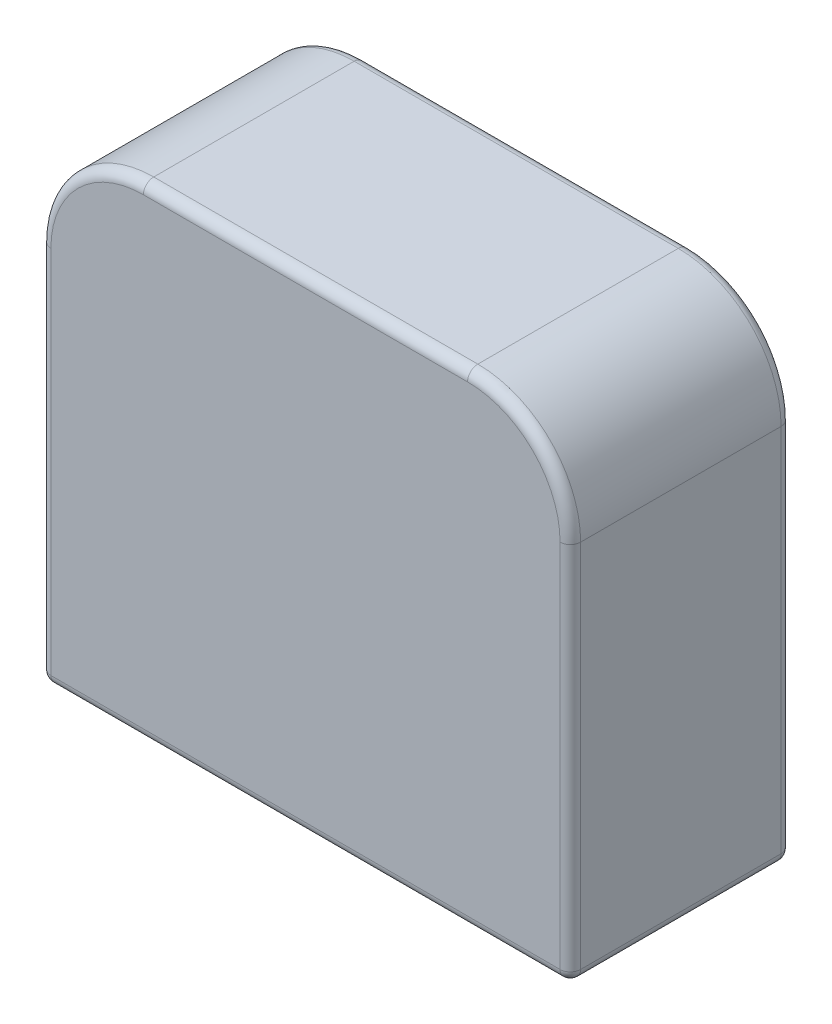
ISO-10303-21;
HEADER;
FILE_DESCRIPTION(('STEP AP214'),'2;1');
FILE_NAME('part.step','',(''),(''),'','','');
FILE_SCHEMA(('AUTOMOTIVE_DESIGN { 1 0 10303 214 1 1 1 1 }'));
ENDSEC;
DATA;
#1=APPLICATION_CONTEXT('core data for automotive mechanical design processes');
#2=APPLICATION_PROTOCOL_DEFINITION('international standard','automotive_design',2000,#1);
#3=PRODUCT_CONTEXT('',#1,'mechanical');
#4=PRODUCT('Part','Part','',(#3));
#5=PRODUCT_RELATED_PRODUCT_CATEGORY('part','',(#4));
#6=PRODUCT_DEFINITION_FORMATION('','',#4);
#7=PRODUCT_DEFINITION_CONTEXT('part definition',#1,'design');
#8=PRODUCT_DEFINITION('design','',#6,#7);
#9=PRODUCT_DEFINITION_SHAPE('','',#8);
#10=(LENGTH_UNIT() NAMED_UNIT(*) SI_UNIT(.MILLI.,.METRE.));
#11=(NAMED_UNIT(*) PLANE_ANGLE_UNIT() SI_UNIT($,.RADIAN.));
#12=(NAMED_UNIT(*) SI_UNIT($,.STERADIAN.) SOLID_ANGLE_UNIT());
#13=UNCERTAINTY_MEASURE_WITH_UNIT(LENGTH_MEASURE(1.E-05),#10,'distance_accuracy_value','');
#14=(GEOMETRIC_REPRESENTATION_CONTEXT(3) GLOBAL_UNCERTAINTY_ASSIGNED_CONTEXT((#13)) GLOBAL_UNIT_ASSIGNED_CONTEXT((#10,
#11,#12)) REPRESENTATION_CONTEXT('',''));
#15=CARTESIAN_POINT('',(0.,0.,0.));
#16=DIRECTION('',(0.,0.,1.));
#17=DIRECTION('',(1.,0.,0.));
#18=AXIS2_PLACEMENT_3D('',#15,#16,#17);
#19=CARTESIAN_POINT('',(25.765,23.5,21.5));
#20=DIRECTION('',(-1.,0.,0.));
#21=DIRECTION('',(0.,-1.,0.));
#22=AXIS2_PLACEMENT_3D('',#19,#20,#21);
#23=PLANE('',#22);
#24=DIRECTION('',(0.,0.,-1.));
#25=VECTOR('',#24,1.);
#26=CARTESIAN_POINT('',(25.765,-22.5,21.5));
#27=LINE('',#26,#25);
#28=CARTESIAN_POINT('',(25.765,-22.5,20.5));
#29=VERTEX_POINT('',#28);
#30=CARTESIAN_POINT('',(25.765,-22.5,1.));
#31=VERTEX_POINT('',#30);
#32=EDGE_CURVE('E50',#29,#31,#27,.T.);
#33=ORIENTED_EDGE('',*,*,#32,.T.);
#34=DIRECTION('',(0.,1.,0.));
#35=VECTOR('',#34,1.);
#36=CARTESIAN_POINT('',(25.765,23.5,1.));
#37=LINE('',#36,#35);
#38=CARTESIAN_POINT('',(25.765,13.5,1.));
#39=VERTEX_POINT('',#38);
#40=EDGE_CURVE('E11',#31,#39,#37,.T.);
#41=ORIENTED_EDGE('',*,*,#40,.T.);
#42=DIRECTION('',(0.,0.,-1.));
#43=VECTOR('',#42,1.);
#44=CARTESIAN_POINT('',(25.765,13.5,21.5));
#45=LINE('',#44,#43);
#46=CARTESIAN_POINT('',(25.765,13.5,20.5));
#47=VERTEX_POINT('',#46);
#48=EDGE_CURVE('E164',#39,#47,#45,.F.);
#49=ORIENTED_EDGE('',*,*,#48,.T.);
#50=DIRECTION('',(0.,1.,0.));
#51=VECTOR('',#50,1.);
#52=CARTESIAN_POINT('',(25.765,-23.5,20.5));
#53=LINE('',#52,#51);
#54=EDGE_CURVE('E61',#47,#29,#53,.F.);
#55=ORIENTED_EDGE('',*,*,#54,.T.);
#56=EDGE_LOOP('',(#33,#41,#49,#55));
#57=FACE_BOUND('',#56,.T.);
#58=ADVANCED_FACE('F41',(#57),#23,.F.);
#59=CARTESIAN_POINT('',(-25.765,23.5,21.5));
#60=DIRECTION('',(0.,-1.,0.));
#61=DIRECTION('',(0.,0.,-1.));
#62=AXIS2_PLACEMENT_3D('',#59,#60,#61);
#63=PLANE('',#62);
#64=DIRECTION('',(0.,0.,-1.));
#65=VECTOR('',#64,1.);
#66=CARTESIAN_POINT('',(15.765,23.5,21.5));
#67=LINE('',#66,#65);
#68=CARTESIAN_POINT('',(15.765,23.5,20.5));
#69=VERTEX_POINT('',#68);
#70=CARTESIAN_POINT('',(15.765,23.5,1.));
#71=VERTEX_POINT('',#70);
#72=EDGE_CURVE('E222',#69,#71,#67,.T.);
#73=ORIENTED_EDGE('',*,*,#72,.T.);
#74=DIRECTION('',(-1.,0.,0.));
#75=VECTOR('',#74,1.);
#76=CARTESIAN_POINT('',(-25.765,23.5,1.));
#77=LINE('',#76,#75);
#78=CARTESIAN_POINT('',(-15.765,23.5,1.));
#79=VERTEX_POINT('',#78);
#80=EDGE_CURVE('E246',#71,#79,#77,.T.);
#81=ORIENTED_EDGE('',*,*,#80,.T.);
#82=DIRECTION('',(0.,0.,-1.));
#83=VECTOR('',#82,1.);
#84=CARTESIAN_POINT('',(-15.765,23.5,21.5));
#85=LINE('',#84,#83);
#86=CARTESIAN_POINT('',(-15.765,23.5,20.5));
#87=VERTEX_POINT('',#86);
#88=EDGE_CURVE('E227',#79,#87,#85,.F.);
#89=ORIENTED_EDGE('',*,*,#88,.T.);
#90=DIRECTION('',(-1.,0.,0.));
#91=VECTOR('',#90,1.);
#92=CARTESIAN_POINT('',(15.765,23.5,20.5));
#93=LINE('',#92,#91);
#94=EDGE_CURVE('E244',#87,#69,#93,.F.);
#95=ORIENTED_EDGE('',*,*,#94,.T.);
#96=EDGE_LOOP('',(#73,#81,#89,#95));
#97=FACE_BOUND('',#96,.T.);
#98=ADVANCED_FACE('F290',(#97),#63,.F.);
#99=CARTESIAN_POINT('',(-25.765,23.5,21.5));
#100=DIRECTION('',(1.,0.,0.));
#101=DIRECTION('',(0.,1.,0.));
#102=AXIS2_PLACEMENT_3D('',#99,#100,#101);
#103=PLANE('',#102);
#104=DIRECTION('',(0.,0.,-1.));
#105=VECTOR('',#104,1.);
#106=CARTESIAN_POINT('',(-25.765,13.5,21.5));
#107=LINE('',#106,#105);
#108=CARTESIAN_POINT('',(-25.765,13.5,20.5));
#109=VERTEX_POINT('',#108);
#110=CARTESIAN_POINT('',(-25.765,13.5,1.));
#111=VERTEX_POINT('',#110);
#112=EDGE_CURVE('E216',#109,#111,#107,.T.);
#113=ORIENTED_EDGE('',*,*,#112,.T.);
#114=DIRECTION('',(0.,-1.,0.));
#115=VECTOR('',#114,1.);
#116=CARTESIAN_POINT('',(-25.765,23.5,1.));
#117=LINE('',#116,#115);
#118=CARTESIAN_POINT('',(-25.765,-22.5,1.));
#119=VERTEX_POINT('',#118);
#120=EDGE_CURVE('E277',#111,#119,#117,.T.);
#121=ORIENTED_EDGE('',*,*,#120,.T.);
#122=DIRECTION('',(0.,0.,-1.));
#123=VECTOR('',#122,1.);
#124=CARTESIAN_POINT('',(-25.765,-22.5,21.5));
#125=LINE('',#124,#123);
#126=CARTESIAN_POINT('',(-25.765,-22.5,20.5));
#127=VERTEX_POINT('',#126);
#128=EDGE_CURVE('E275',#119,#127,#125,.F.);
#129=ORIENTED_EDGE('',*,*,#128,.T.);
#130=DIRECTION('',(0.,-1.,0.));
#131=VECTOR('',#130,1.);
#132=CARTESIAN_POINT('',(-25.765,13.5,20.5));
#133=LINE('',#132,#131);
#134=EDGE_CURVE('E273',#127,#109,#133,.F.);
#135=ORIENTED_EDGE('',*,*,#134,.T.);
#136=EDGE_LOOP('',(#113,#121,#129,#135));
#137=FACE_BOUND('',#136,.T.);
#138=ADVANCED_FACE('F306',(#137),#103,.F.);
#139=CARTESIAN_POINT('',(-25.765,-23.5,21.5));
#140=DIRECTION('',(0.,1.,0.));
#141=DIRECTION('',(0.,0.,1.));
#142=AXIS2_PLACEMENT_3D('',#139,#140,#141);
#143=PLANE('',#142);
#144=DIRECTION('',(1.,0.,0.));
#145=VECTOR('',#144,1.);
#146=CARTESIAN_POINT('',(-25.765,-23.5,20.5));
#147=LINE('',#146,#145);
#148=CARTESIAN_POINT('',(24.765,-23.5,20.5));
#149=VERTEX_POINT('',#148);
#150=CARTESIAN_POINT('',(-24.765,-23.5,20.5));
#151=VERTEX_POINT('',#150);
#152=EDGE_CURVE('E264',#149,#151,#147,.F.);
#153=ORIENTED_EDGE('',*,*,#152,.T.);
#154=DIRECTION('',(0.,0.,-1.));
#155=VECTOR('',#154,1.);
#156=CARTESIAN_POINT('',(-24.765,-23.5,21.5));
#157=LINE('',#156,#155);
#158=CARTESIAN_POINT('',(-24.765,-23.5,1.));
#159=VERTEX_POINT('',#158);
#160=EDGE_CURVE('E270',#151,#159,#157,.T.);
#161=ORIENTED_EDGE('',*,*,#160,.T.);
#162=DIRECTION('',(1.,0.,0.));
#163=VECTOR('',#162,1.);
#164=CARTESIAN_POINT('',(-25.765,-23.5,1.));
#165=LINE('',#164,#163);
#166=CARTESIAN_POINT('',(24.765,-23.5,1.));
#167=VERTEX_POINT('',#166);
#168=EDGE_CURVE('E268',#159,#167,#165,.T.);
#169=ORIENTED_EDGE('',*,*,#168,.T.);
#170=DIRECTION('',(0.,0.,-1.));
#171=VECTOR('',#170,1.);
#172=CARTESIAN_POINT('',(24.765,-23.5,21.5));
#173=LINE('',#172,#171);
#174=EDGE_CURVE('E266',#167,#149,#173,.F.);
#175=ORIENTED_EDGE('',*,*,#174,.T.);
#176=EDGE_LOOP('',(#153,#161,#169,#175));
#177=FACE_BOUND('',#176,.T.);
#178=ADVANCED_FACE('F322',(#177),#143,.F.);
#179=CARTESIAN_POINT('',(0.,0.,21.5));
#180=DIRECTION('',(0.,0.,1.));
#181=DIRECTION('',(1.,0.,0.));
#182=AXIS2_PLACEMENT_3D('',#179,#180,#181);
#183=PLANE('',#182);
#184=CARTESIAN_POINT('',(-15.765,13.5,21.5));
#185=DIRECTION('',(0.,0.,1.));
#186=DIRECTION('',(1.,0.,0.));
#187=AXIS2_PLACEMENT_3D('',#184,#185,#186);
#188=CIRCLE('',#187,9.);
#189=CARTESIAN_POINT('',(-15.765,22.5,21.5));
#190=VERTEX_POINT('',#189);
#191=CARTESIAN_POINT('',(-24.765,13.5,21.5));
#192=VERTEX_POINT('',#191);
#193=EDGE_CURVE('E259',#190,#192,#188,.T.);
#194=ORIENTED_EDGE('',*,*,#193,.T.);
#195=DIRECTION('',(0.,-1.,0.));
#196=VECTOR('',#195,1.);
#197=CARTESIAN_POINT('',(-24.765,-23.5,21.5));
#198=LINE('',#197,#196);
#199=CARTESIAN_POINT('',(-24.765,-22.5,21.5));
#200=VERTEX_POINT('',#199);
#201=EDGE_CURVE('E262',#192,#200,#198,.T.);
#202=ORIENTED_EDGE('',*,*,#201,.T.);
#203=DIRECTION('',(1.,0.,0.));
#204=VECTOR('',#203,1.);
#205=CARTESIAN_POINT('',(25.765,-22.5,21.5));
#206=LINE('',#205,#204);
#207=CARTESIAN_POINT('',(24.765,-22.5,21.5));
#208=VERTEX_POINT('',#207);
#209=EDGE_CURVE('E253',#200,#208,#206,.T.);
#210=ORIENTED_EDGE('',*,*,#209,.T.);
#211=DIRECTION('',(0.,1.,0.));
#212=VECTOR('',#211,1.);
#213=CARTESIAN_POINT('',(24.765,13.5,21.5));
#214=LINE('',#213,#212);
#215=CARTESIAN_POINT('',(24.765,13.5,21.5));
#216=VERTEX_POINT('',#215);
#217=EDGE_CURVE('E251',#208,#216,#214,.T.);
#218=ORIENTED_EDGE('',*,*,#217,.T.);
#219=CARTESIAN_POINT('',(15.765,13.5,21.5));
#220=DIRECTION('',(0.,0.,1.));
#221=DIRECTION('',(1.,0.,0.));
#222=AXIS2_PLACEMENT_3D('',#219,#220,#221);
#223=CIRCLE('',#222,9.);
#224=CARTESIAN_POINT('',(15.765,22.5,21.5));
#225=VERTEX_POINT('',#224);
#226=EDGE_CURVE('E255',#216,#225,#223,.T.);
#227=ORIENTED_EDGE('',*,*,#226,.T.);
#228=DIRECTION('',(-1.,0.,0.));
#229=VECTOR('',#228,1.);
#230=CARTESIAN_POINT('',(-15.765,22.5,21.5));
#231=LINE('',#230,#229);
#232=EDGE_CURVE('E257',#225,#190,#231,.T.);
#233=ORIENTED_EDGE('',*,*,#232,.T.);
#234=EDGE_LOOP('',(#194,#202,#210,#218,#227,#233));
#235=FACE_BOUND('',#234,.T.);
#236=ADVANCED_FACE('F420',(#235),#183,.T.);
#237=CARTESIAN_POINT('',(0.,0.,0.));
#238=DIRECTION('',(0.,0.,1.));
#239=DIRECTION('',(1.,0.,0.));
#240=AXIS2_PLACEMENT_3D('',#237,#238,#239);
#241=PLANE('',#240);
#242=DIRECTION('',(1.,0.,0.));
#243=VECTOR('',#242,1.);
#244=CARTESIAN_POINT('',(0.,-22.5,0.));
#245=LINE('',#244,#243);
#246=CARTESIAN_POINT('',(24.765,-22.5,0.));
#247=VERTEX_POINT('',#246);
#248=CARTESIAN_POINT('',(-24.765,-22.5,0.));
#249=VERTEX_POINT('',#248);
#250=EDGE_CURVE('E153',#247,#249,#245,.F.);
#251=ORIENTED_EDGE('',*,*,#250,.T.);
#252=DIRECTION('',(0.,-1.,0.));
#253=VECTOR('',#252,1.);
#254=CARTESIAN_POINT('',(-24.765,0.,0.));
#255=LINE('',#254,#253);
#256=CARTESIAN_POINT('',(-24.765,13.5,0.));
#257=VERTEX_POINT('',#256);
#258=EDGE_CURVE('E237',#249,#257,#255,.F.);
#259=ORIENTED_EDGE('',*,*,#258,.T.);
#260=CARTESIAN_POINT('',(-15.765,13.5,0.));
#261=DIRECTION('',(0.,0.,1.));
#262=DIRECTION('',(1.,0.,0.));
#263=AXIS2_PLACEMENT_3D('',#260,#261,#262);
#264=CIRCLE('',#263,9.);
#265=CARTESIAN_POINT('',(-15.765,22.5,0.));
#266=VERTEX_POINT('',#265);
#267=EDGE_CURVE('E235',#257,#266,#264,.F.);
#268=ORIENTED_EDGE('',*,*,#267,.T.);
#269=DIRECTION('',(-1.,0.,0.));
#270=VECTOR('',#269,1.);
#271=CARTESIAN_POINT('',(0.,22.5,0.));
#272=LINE('',#271,#270);
#273=CARTESIAN_POINT('',(15.765,22.5,0.));
#274=VERTEX_POINT('',#273);
#275=EDGE_CURVE('E148',#266,#274,#272,.F.);
#276=ORIENTED_EDGE('',*,*,#275,.T.);
#277=CARTESIAN_POINT('',(15.765,13.5,0.));
#278=DIRECTION('',(0.,0.,1.));
#279=DIRECTION('',(1.,0.,0.));
#280=AXIS2_PLACEMENT_3D('',#277,#278,#279);
#281=CIRCLE('',#280,9.);
#282=CARTESIAN_POINT('',(24.765,13.5,0.));
#283=VERTEX_POINT('',#282);
#284=EDGE_CURVE('E141',#274,#283,#281,.F.);
#285=ORIENTED_EDGE('',*,*,#284,.T.);
#286=DIRECTION('',(0.,1.,0.));
#287=VECTOR('',#286,1.);
#288=CARTESIAN_POINT('',(24.765,0.,0.));
#289=LINE('',#288,#287);
#290=EDGE_CURVE('E144',#283,#247,#289,.F.);
#291=ORIENTED_EDGE('',*,*,#290,.T.);
#292=EDGE_LOOP('',(#251,#259,#268,#276,#285,#291));
#293=FACE_BOUND('',#292,.T.);
#294=ADVANCED_FACE('F143',(#293),#241,.F.);
#295=CARTESIAN_POINT('',(-15.765,13.5,21.5));
#296=DIRECTION('',(0.,0.,-1.));
#297=DIRECTION('',(-1.,0.,0.));
#298=AXIS2_PLACEMENT_3D('',#295,#296,#297);
#299=CYLINDRICAL_SURFACE('',#298,10.);
#300=ORIENTED_EDGE('',*,*,#88,.F.);
#301=CARTESIAN_POINT('',(-15.765,13.5,1.));
#302=DIRECTION('',(0.,0.,1.));
#303=DIRECTION('',(1.,0.,0.));
#304=AXIS2_PLACEMENT_3D('',#301,#302,#303);
#305=CIRCLE('',#304,10.);
#306=EDGE_CURVE('E241',#79,#111,#305,.T.);
#307=ORIENTED_EDGE('',*,*,#306,.T.);
#308=ORIENTED_EDGE('',*,*,#112,.F.);
#309=CARTESIAN_POINT('',(-15.765,13.5,20.5));
#310=DIRECTION('',(0.,0.,1.));
#311=DIRECTION('',(1.,0.,0.));
#312=AXIS2_PLACEMENT_3D('',#309,#310,#311);
#313=CIRCLE('',#312,10.);
#314=EDGE_CURVE('E239',#109,#87,#313,.F.);
#315=ORIENTED_EDGE('',*,*,#314,.T.);
#316=EDGE_LOOP('',(#300,#307,#308,#315));
#317=FACE_BOUND('',#316,.T.);
#318=ADVANCED_FACE('F294',(#317),#299,.T.);
#319=CARTESIAN_POINT('',(15.765,13.5,21.5));
#320=DIRECTION('',(0.,0.,-1.));
#321=DIRECTION('',(-1.,0.,0.));
#322=AXIS2_PLACEMENT_3D('',#319,#320,#321);
#323=CYLINDRICAL_SURFACE('',#322,10.);
#324=ORIENTED_EDGE('',*,*,#48,.F.);
#325=CARTESIAN_POINT('',(15.765,13.5,1.));
#326=DIRECTION('',(0.,0.,1.));
#327=DIRECTION('',(1.,0.,0.));
#328=AXIS2_PLACEMENT_3D('',#325,#326,#327);
#329=CIRCLE('',#328,10.);
#330=EDGE_CURVE('E167',#39,#71,#329,.T.);
#331=ORIENTED_EDGE('',*,*,#330,.T.);
#332=ORIENTED_EDGE('',*,*,#72,.F.);
#333=CARTESIAN_POINT('',(15.765,13.5,20.5));
#334=DIRECTION('',(0.,0.,1.));
#335=DIRECTION('',(1.,0.,0.));
#336=AXIS2_PLACEMENT_3D('',#333,#334,#335);
#337=CIRCLE('',#336,10.);
#338=EDGE_CURVE('E248',#69,#47,#337,.F.);
#339=ORIENTED_EDGE('',*,*,#338,.T.);
#340=EDGE_LOOP('',(#324,#331,#332,#339));
#341=FACE_BOUND('',#340,.T.);
#342=ADVANCED_FACE('F342',(#341),#323,.T.);
#343=CARTESIAN_POINT('',(15.765,13.5,20.5));
#344=DIRECTION('',(0.,0.,1.));
#345=DIRECTION('',(1.,0.,0.));
#346=AXIS2_PLACEMENT_3D('',#343,#344,#345);
#347=TOROIDAL_SURFACE('',#346,9.,1.);
#348=CARTESIAN_POINT('',(24.765,13.5,20.5));
#349=DIRECTION('',(0.,-1.,0.));
#350=DIRECTION('',(0.,0.,-1.));
#351=AXIS2_PLACEMENT_3D('',#348,#349,#350);
#352=CIRCLE('',#351,1.);
#353=EDGE_CURVE('E210',#47,#216,#352,.T.);
#354=ORIENTED_EDGE('',*,*,#353,.F.);
#355=ORIENTED_EDGE('',*,*,#338,.F.);
#356=CARTESIAN_POINT('',(15.765,22.5,20.5));
#357=DIRECTION('',(-1.,0.,0.));
#358=DIRECTION('',(0.,0.,1.));
#359=AXIS2_PLACEMENT_3D('',#356,#357,#358);
#360=CIRCLE('',#359,1.);
#361=EDGE_CURVE('E45',#225,#69,#360,.T.);
#362=ORIENTED_EDGE('',*,*,#361,.F.);
#363=ORIENTED_EDGE('',*,*,#226,.F.);
#364=EDGE_LOOP('',(#354,#355,#362,#363));
#365=FACE_BOUND('',#364,.T.);
#366=ADVANCED_FACE('F43',(#365),#347,.T.);
#367=CARTESIAN_POINT('',(0.,22.5,20.5));
#368=DIRECTION('',(1.,0.,0.));
#369=DIRECTION('',(0.,0.,-1.));
#370=AXIS2_PLACEMENT_3D('',#367,#368,#369);
#371=CYLINDRICAL_SURFACE('',#370,1.);
#372=ORIENTED_EDGE('',*,*,#361,.T.);
#373=ORIENTED_EDGE('',*,*,#94,.F.);
#374=CARTESIAN_POINT('',(-15.765,22.5,20.5));
#375=DIRECTION('',(-1.,0.,0.));
#376=DIRECTION('',(0.,0.,1.));
#377=AXIS2_PLACEMENT_3D('',#374,#375,#376);
#378=CIRCLE('',#377,1.);
#379=EDGE_CURVE('E208',#190,#87,#378,.T.);
#380=ORIENTED_EDGE('',*,*,#379,.F.);
#381=ORIENTED_EDGE('',*,*,#232,.F.);
#382=EDGE_LOOP('',(#372,#373,#380,#381));
#383=FACE_BOUND('',#382,.T.);
#384=ADVANCED_FACE('F338',(#383),#371,.T.);
#385=CARTESIAN_POINT('',(24.765,0.,20.5));
#386=DIRECTION('',(0.,-1.,0.));
#387=DIRECTION('',(1.,0.,0.));
#388=AXIS2_PLACEMENT_3D('',#385,#386,#387);
#389=CYLINDRICAL_SURFACE('',#388,1.);
#390=ORIENTED_EDGE('',*,*,#353,.T.);
#391=ORIENTED_EDGE('',*,*,#217,.F.);
#392=CARTESIAN_POINT('',(24.765,-22.5,20.5));
#393=DIRECTION('',(0.,-1.,0.));
#394=DIRECTION('',(0.,0.,-1.));
#395=AXIS2_PLACEMENT_3D('',#392,#393,#394);
#396=CIRCLE('',#395,1.);
#397=EDGE_CURVE('E205',#29,#208,#396,.T.);
#398=ORIENTED_EDGE('',*,*,#397,.F.);
#399=ORIENTED_EDGE('',*,*,#54,.F.);
#400=EDGE_LOOP('',(#390,#391,#398,#399));
#401=FACE_BOUND('',#400,.T.);
#402=ADVANCED_FACE('F345',(#401),#389,.T.);
#403=CARTESIAN_POINT('',(-15.765,13.5,20.5));
#404=DIRECTION('',(0.,0.,1.));
#405=DIRECTION('',(1.,0.,0.));
#406=AXIS2_PLACEMENT_3D('',#403,#404,#405);
#407=TOROIDAL_SURFACE('',#406,9.,1.);
#408=ORIENTED_EDGE('',*,*,#379,.T.);
#409=ORIENTED_EDGE('',*,*,#314,.F.);
#410=CARTESIAN_POINT('',(-24.765,13.5,20.5));
#411=DIRECTION('',(0.,-1.,0.));
#412=DIRECTION('',(0.,0.,-1.));
#413=AXIS2_PLACEMENT_3D('',#410,#411,#412);
#414=CIRCLE('',#413,1.);
#415=EDGE_CURVE('E202',#192,#109,#414,.T.);
#416=ORIENTED_EDGE('',*,*,#415,.F.);
#417=ORIENTED_EDGE('',*,*,#193,.F.);
#418=EDGE_LOOP('',(#408,#409,#416,#417));
#419=FACE_BOUND('',#418,.T.);
#420=ADVANCED_FACE('F335',(#419),#407,.T.);
#421=CARTESIAN_POINT('',(24.765,-22.5,20.5));
#422=DIRECTION('',(0.,0.,1.));
#423=DIRECTION('',(1.,0.,0.));
#424=AXIS2_PLACEMENT_3D('',#421,#422,#423);
#425=SPHERICAL_SURFACE('',#424,1.);
#426=CARTESIAN_POINT('',(24.765,-22.5,20.5));
#427=DIRECTION('',(0.,0.,1.));
#428=DIRECTION('',(1.,0.,0.));
#429=AXIS2_PLACEMENT_3D('',#426,#427,#428);
#430=CIRCLE('',#429,1.);
#431=EDGE_CURVE('E196',#29,#149,#430,.F.);
#432=ORIENTED_EDGE('',*,*,#431,.F.);
#433=ORIENTED_EDGE('',*,*,#397,.T.);
#434=CARTESIAN_POINT('',(24.765,-22.5,20.5));
#435=DIRECTION('',(1.,0.,0.));
#436=DIRECTION('',(0.,0.,-1.));
#437=AXIS2_PLACEMENT_3D('',#434,#435,#436);
#438=CIRCLE('',#437,1.);
#439=EDGE_CURVE('E199',#149,#208,#438,.F.);
#440=ORIENTED_EDGE('',*,*,#439,.F.);
#441=EDGE_LOOP('',(#432,#433,#440));
#442=FACE_BOUND('',#441,.T.);
#443=ADVANCED_FACE('F349',(#442),#425,.T.);
#444=CARTESIAN_POINT('',(-24.765,0.,20.5));
#445=DIRECTION('',(0.,1.,0.));
#446=DIRECTION('',(-1.,0.,0.));
#447=AXIS2_PLACEMENT_3D('',#444,#445,#446);
#448=CYLINDRICAL_SURFACE('',#447,1.);
#449=ORIENTED_EDGE('',*,*,#415,.T.);
#450=ORIENTED_EDGE('',*,*,#134,.F.);
#451=CARTESIAN_POINT('',(-24.765,-22.5,20.5));
#452=DIRECTION('',(0.,-1.,0.));
#453=DIRECTION('',(0.,0.,-1.));
#454=AXIS2_PLACEMENT_3D('',#451,#452,#453);
#455=CIRCLE('',#454,1.);
#456=EDGE_CURVE('E193',#200,#127,#455,.T.);
#457=ORIENTED_EDGE('',*,*,#456,.F.);
#458=ORIENTED_EDGE('',*,*,#201,.F.);
#459=EDGE_LOOP('',(#449,#450,#457,#458));
#460=FACE_BOUND('',#459,.T.);
#461=ADVANCED_FACE('F332',(#460),#448,.T.);
#462=CARTESIAN_POINT('',(0.,-22.5,20.5));
#463=DIRECTION('',(-1.,0.,0.));
#464=DIRECTION('',(0.,0.,1.));
#465=AXIS2_PLACEMENT_3D('',#462,#463,#464);
#466=CYLINDRICAL_SURFACE('',#465,1.);
#467=ORIENTED_EDGE('',*,*,#439,.T.);
#468=ORIENTED_EDGE('',*,*,#209,.F.);
#469=CARTESIAN_POINT('',(-24.765,-22.5,20.5));
#470=DIRECTION('',(-1.,0.,0.));
#471=DIRECTION('',(0.,0.,1.));
#472=AXIS2_PLACEMENT_3D('',#469,#470,#471);
#473=CIRCLE('',#472,1.);
#474=EDGE_CURVE('E190',#151,#200,#473,.T.);
#475=ORIENTED_EDGE('',*,*,#474,.F.);
#476=ORIENTED_EDGE('',*,*,#152,.F.);
#477=EDGE_LOOP('',(#467,#468,#475,#476));
#478=FACE_BOUND('',#477,.T.);
#479=ADVANCED_FACE('F327',(#478),#466,.T.);
#480=CARTESIAN_POINT('',(24.765,-22.5,21.5));
#481=DIRECTION('',(0.,0.,-1.));
#482=DIRECTION('',(-1.,0.,0.));
#483=AXIS2_PLACEMENT_3D('',#480,#481,#482);
#484=CYLINDRICAL_SURFACE('',#483,1.);
#485=ORIENTED_EDGE('',*,*,#431,.T.);
#486=ORIENTED_EDGE('',*,*,#174,.F.);
#487=CARTESIAN_POINT('',(24.765,-22.5,1.));
#488=DIRECTION('',(0.,0.,-1.));
#489=DIRECTION('',(-1.,0.,0.));
#490=AXIS2_PLACEMENT_3D('',#487,#488,#489);
#491=CIRCLE('',#490,1.);
#492=EDGE_CURVE('E187',#31,#167,#491,.T.);
#493=ORIENTED_EDGE('',*,*,#492,.F.);
#494=ORIENTED_EDGE('',*,*,#32,.F.);
#495=EDGE_LOOP('',(#485,#486,#493,#494));
#496=FACE_BOUND('',#495,.T.);
#497=ADVANCED_FACE('F351',(#496),#484,.T.);
#498=CARTESIAN_POINT('',(-24.765,-22.5,20.5));
#499=DIRECTION('',(0.,0.,1.));
#500=DIRECTION('',(1.,0.,0.));
#501=AXIS2_PLACEMENT_3D('',#498,#499,#500);
#502=SPHERICAL_SURFACE('',#501,1.);
#503=ORIENTED_EDGE('',*,*,#474,.T.);
#504=ORIENTED_EDGE('',*,*,#456,.T.);
#505=CARTESIAN_POINT('',(-24.765,-22.5,20.5));
#506=DIRECTION('',(0.,0.,1.));
#507=DIRECTION('',(1.,0.,0.));
#508=AXIS2_PLACEMENT_3D('',#505,#506,#507);
#509=CIRCLE('',#508,1.);
#510=EDGE_CURVE('E184',#151,#127,#509,.F.);
#511=ORIENTED_EDGE('',*,*,#510,.F.);
#512=EDGE_LOOP('',(#503,#504,#511));
#513=FACE_BOUND('',#512,.T.);
#514=ADVANCED_FACE('F330',(#513),#502,.T.);
#515=CARTESIAN_POINT('',(24.765,-22.5,1.));
#516=DIRECTION('',(0.,-1.,0.));
#517=DIRECTION('',(0.,0.,-1.));
#518=AXIS2_PLACEMENT_3D('',#515,#516,#517);
#519=SPHERICAL_SURFACE('',#518,1.);
#520=CARTESIAN_POINT('',(24.765,-22.5,1.));
#521=DIRECTION('',(0.,-1.,0.));
#522=DIRECTION('',(0.,0.,-1.));
#523=AXIS2_PLACEMENT_3D('',#520,#521,#522);
#524=CIRCLE('',#523,1.);
#525=EDGE_CURVE('E162',#31,#247,#524,.F.);
#526=ORIENTED_EDGE('',*,*,#525,.F.);
#527=ORIENTED_EDGE('',*,*,#492,.T.);
#528=CARTESIAN_POINT('',(24.765,-22.5,1.));
#529=DIRECTION('',(1.,0.,0.));
#530=DIRECTION('',(0.,0.,-1.));
#531=AXIS2_PLACEMENT_3D('',#528,#529,#530);
#532=CIRCLE('',#531,1.);
#533=EDGE_CURVE('E181',#247,#167,#532,.F.);
#534=ORIENTED_EDGE('',*,*,#533,.F.);
#535=EDGE_LOOP('',(#526,#527,#534));
#536=FACE_BOUND('',#535,.T.);
#537=ADVANCED_FACE('F353',(#536),#519,.T.);
#538=CARTESIAN_POINT('',(-24.765,-22.5,21.5));
#539=DIRECTION('',(0.,0.,-1.));
#540=DIRECTION('',(-1.,0.,0.));
#541=AXIS2_PLACEMENT_3D('',#538,#539,#540);
#542=CYLINDRICAL_SURFACE('',#541,1.);
#543=ORIENTED_EDGE('',*,*,#510,.T.);
#544=ORIENTED_EDGE('',*,*,#128,.F.);
#545=CARTESIAN_POINT('',(-24.765,-22.5,1.));
#546=DIRECTION('',(0.,0.,-1.));
#547=DIRECTION('',(-1.,0.,0.));
#548=AXIS2_PLACEMENT_3D('',#545,#546,#547);
#549=CIRCLE('',#548,1.);
#550=EDGE_CURVE('E171',#159,#119,#549,.T.);
#551=ORIENTED_EDGE('',*,*,#550,.F.);
#552=ORIENTED_EDGE('',*,*,#160,.F.);
#553=EDGE_LOOP('',(#543,#544,#551,#552));
#554=FACE_BOUND('',#553,.T.);
#555=ADVANCED_FACE('F310',(#554),#542,.T.);
#556=CARTESIAN_POINT('',(-25.765,-22.5,1.));
#557=DIRECTION('',(1.,0.,0.));
#558=DIRECTION('',(0.,0.,-1.));
#559=AXIS2_PLACEMENT_3D('',#556,#557,#558);
#560=CYLINDRICAL_SURFACE('',#559,1.);
#561=ORIENTED_EDGE('',*,*,#533,.T.);
#562=ORIENTED_EDGE('',*,*,#168,.F.);
#563=CARTESIAN_POINT('',(-24.765,-22.5,1.));
#564=DIRECTION('',(-1.,0.,0.));
#565=DIRECTION('',(0.,0.,1.));
#566=AXIS2_PLACEMENT_3D('',#563,#564,#565);
#567=CIRCLE('',#566,1.);
#568=EDGE_CURVE('E168',#249,#159,#567,.T.);
#569=ORIENTED_EDGE('',*,*,#568,.F.);
#570=ORIENTED_EDGE('',*,*,#250,.F.);
#571=EDGE_LOOP('',(#561,#562,#569,#570));
#572=FACE_BOUND('',#571,.T.);
#573=ADVANCED_FACE('F319',(#572),#560,.T.);
#574=CARTESIAN_POINT('',(24.765,23.5,1.));
#575=DIRECTION('',(0.,1.,0.));
#576=DIRECTION('',(-1.,0.,0.));
#577=AXIS2_PLACEMENT_3D('',#574,#575,#576);
#578=CYLINDRICAL_SURFACE('',#577,1.);
#579=ORIENTED_EDGE('',*,*,#525,.T.);
#580=ORIENTED_EDGE('',*,*,#290,.F.);
#581=CARTESIAN_POINT('',(24.765,13.5,1.));
#582=DIRECTION('',(0.,1.,0.));
#583=DIRECTION('',(0.,0.,1.));
#584=AXIS2_PLACEMENT_3D('',#581,#582,#583);
#585=CIRCLE('',#584,1.);
#586=EDGE_CURVE('E159',#39,#283,#585,.T.);
#587=ORIENTED_EDGE('',*,*,#586,.F.);
#588=ORIENTED_EDGE('',*,*,#40,.F.);
#589=EDGE_LOOP('',(#579,#580,#587,#588));
#590=FACE_BOUND('',#589,.T.);
#591=ADVANCED_FACE('F157',(#590),#578,.T.);
#592=CARTESIAN_POINT('',(-24.765,-22.5,1.));
#593=DIRECTION('',(0.,-1.,0.));
#594=DIRECTION('',(0.,0.,-1.));
#595=AXIS2_PLACEMENT_3D('',#592,#593,#594);
#596=SPHERICAL_SURFACE('',#595,1.);
#597=ORIENTED_EDGE('',*,*,#568,.T.);
#598=ORIENTED_EDGE('',*,*,#550,.T.);
#599=CARTESIAN_POINT('',(-24.765,-22.5,1.));
#600=DIRECTION('',(0.,-1.,0.));
#601=DIRECTION('',(0.,0.,-1.));
#602=AXIS2_PLACEMENT_3D('',#599,#600,#601);
#603=CIRCLE('',#602,1.);
#604=EDGE_CURVE('E169',#249,#119,#603,.F.);
#605=ORIENTED_EDGE('',*,*,#604,.F.);
#606=EDGE_LOOP('',(#597,#598,#605));
#607=FACE_BOUND('',#606,.T.);
#608=ADVANCED_FACE('F315',(#607),#596,.T.);
#609=CARTESIAN_POINT('',(15.765,13.5,1.));
#610=DIRECTION('',(0.,0.,1.));
#611=DIRECTION('',(1.,0.,0.));
#612=AXIS2_PLACEMENT_3D('',#609,#610,#611);
#613=TOROIDAL_SURFACE('',#612,9.,1.);
#614=ORIENTED_EDGE('',*,*,#586,.T.);
#615=ORIENTED_EDGE('',*,*,#284,.F.);
#616=CARTESIAN_POINT('',(15.765,22.5,1.));
#617=DIRECTION('',(-1.,0.,0.));
#618=DIRECTION('',(0.,0.,1.));
#619=AXIS2_PLACEMENT_3D('',#616,#617,#618);
#620=CIRCLE('',#619,1.);
#621=EDGE_CURVE('E174',#71,#274,#620,.T.);
#622=ORIENTED_EDGE('',*,*,#621,.F.);
#623=ORIENTED_EDGE('',*,*,#330,.F.);
#624=EDGE_LOOP('',(#614,#615,#622,#623));
#625=FACE_BOUND('',#624,.T.);
#626=ADVANCED_FACE('F166',(#625),#613,.T.);
#627=CARTESIAN_POINT('',(-24.765,23.5,1.));
#628=DIRECTION('',(0.,-1.,0.));
#629=DIRECTION('',(1.,0.,0.));
#630=AXIS2_PLACEMENT_3D('',#627,#628,#629);
#631=CYLINDRICAL_SURFACE('',#630,1.);
#632=ORIENTED_EDGE('',*,*,#604,.T.);
#633=ORIENTED_EDGE('',*,*,#120,.F.);
#634=CARTESIAN_POINT('',(-24.765,13.5,1.));
#635=DIRECTION('',(0.,1.,0.));
#636=DIRECTION('',(0.,0.,1.));
#637=AXIS2_PLACEMENT_3D('',#634,#635,#636);
#638=CIRCLE('',#637,1.);
#639=EDGE_CURVE('E283',#257,#111,#638,.T.);
#640=ORIENTED_EDGE('',*,*,#639,.F.);
#641=ORIENTED_EDGE('',*,*,#258,.F.);
#642=EDGE_LOOP('',(#632,#633,#640,#641));
#643=FACE_BOUND('',#642,.T.);
#644=ADVANCED_FACE('F303',(#643),#631,.T.);
#645=CARTESIAN_POINT('',(-25.765,22.5,1.));
#646=DIRECTION('',(-1.,0.,0.));
#647=DIRECTION('',(0.,0.,1.));
#648=AXIS2_PLACEMENT_3D('',#645,#646,#647);
#649=CYLINDRICAL_SURFACE('',#648,1.);
#650=ORIENTED_EDGE('',*,*,#621,.T.);
#651=ORIENTED_EDGE('',*,*,#275,.F.);
#652=CARTESIAN_POINT('',(-15.765,22.5,1.));
#653=DIRECTION('',(-1.,0.,0.));
#654=DIRECTION('',(0.,0.,1.));
#655=AXIS2_PLACEMENT_3D('',#652,#653,#654);
#656=CIRCLE('',#655,1.);
#657=EDGE_CURVE('E281',#79,#266,#656,.T.);
#658=ORIENTED_EDGE('',*,*,#657,.F.);
#659=ORIENTED_EDGE('',*,*,#80,.F.);
#660=EDGE_LOOP('',(#650,#651,#658,#659));
#661=FACE_BOUND('',#660,.T.);
#662=ADVANCED_FACE('F286',(#661),#649,.T.);
#663=CARTESIAN_POINT('',(-15.765,13.5,1.));
#664=DIRECTION('',(0.,0.,1.));
#665=DIRECTION('',(1.,0.,0.));
#666=AXIS2_PLACEMENT_3D('',#663,#664,#665);
#667=TOROIDAL_SURFACE('',#666,9.,1.);
#668=ORIENTED_EDGE('',*,*,#639,.T.);
#669=ORIENTED_EDGE('',*,*,#306,.F.);
#670=ORIENTED_EDGE('',*,*,#657,.T.);
#671=ORIENTED_EDGE('',*,*,#267,.F.);
#672=EDGE_LOOP('',(#668,#669,#670,#671));
#673=FACE_BOUND('',#672,.T.);
#674=ADVANCED_FACE('F297',(#673),#667,.T.);
#675=CLOSED_SHELL('',(#58,#98,#138,#178,#236,#294,#318,#342,#366,#384,#402,#420,#443,#461,#479,
#497,#514,#537,#555,#573,#591,#608,#626,#644,#662,#674));
#676=MANIFOLD_SOLID_BREP('B2',#675);
#677=ADVANCED_BREP_SHAPE_REPRESENTATION('',(#18,#676),#14);
#678=SHAPE_DEFINITION_REPRESENTATION(#9,#677);
ENDSEC;
END-ISO-10303-21;
